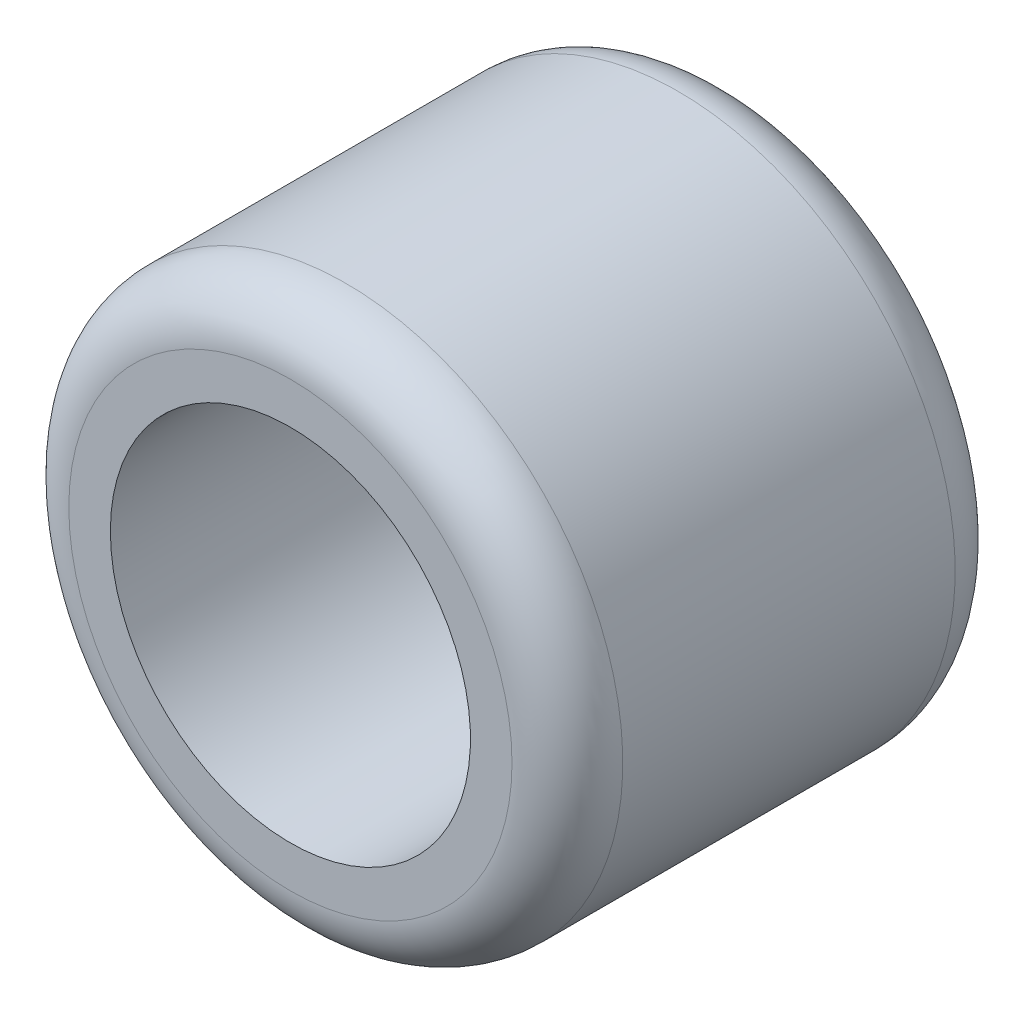
ISO-10303-21;
HEADER;
FILE_DESCRIPTION(('STEP AP214'),'2;1');
FILE_NAME('part.step','',(''),(''),'','','');
FILE_SCHEMA(('AUTOMOTIVE_DESIGN { 1 0 10303 214 1 1 1 1 }'));
ENDSEC;
DATA;
#1=APPLICATION_CONTEXT('core data for automotive mechanical design processes');
#2=APPLICATION_PROTOCOL_DEFINITION('international standard','automotive_design',2000,#1);
#3=PRODUCT_CONTEXT('',#1,'mechanical');
#4=PRODUCT('Part','Part','',(#3));
#5=PRODUCT_RELATED_PRODUCT_CATEGORY('part','',(#4));
#6=PRODUCT_DEFINITION_FORMATION('','',#4);
#7=PRODUCT_DEFINITION_CONTEXT('part definition',#1,'design');
#8=PRODUCT_DEFINITION('design','',#6,#7);
#9=PRODUCT_DEFINITION_SHAPE('','',#8);
#10=(LENGTH_UNIT() NAMED_UNIT(*) SI_UNIT(.MILLI.,.METRE.));
#11=(NAMED_UNIT(*) PLANE_ANGLE_UNIT() SI_UNIT($,.RADIAN.));
#12=(NAMED_UNIT(*) SI_UNIT($,.STERADIAN.) SOLID_ANGLE_UNIT());
#13=UNCERTAINTY_MEASURE_WITH_UNIT(LENGTH_MEASURE(1.E-05),#10,'distance_accuracy_value','');
#14=(GEOMETRIC_REPRESENTATION_CONTEXT(3) GLOBAL_UNCERTAINTY_ASSIGNED_CONTEXT((#13)) GLOBAL_UNIT_ASSIGNED_CONTEXT((#10,
#11,#12)) REPRESENTATION_CONTEXT('',''));
#15=CARTESIAN_POINT('',(0.,0.,0.));
#16=DIRECTION('',(0.,0.,1.));
#17=DIRECTION('',(1.,0.,0.));
#18=AXIS2_PLACEMENT_3D('',#15,#16,#17);
#19=CARTESIAN_POINT('',(0.,0.,-8.));
#20=DIRECTION('',(0.,0.,1.));
#21=DIRECTION('',(1.,0.,0.));
#22=AXIS2_PLACEMENT_3D('',#19,#20,#21);
#23=CYLINDRICAL_SURFACE('',#22,5.);
#24=CARTESIAN_POINT('',(0.,0.,-7.));
#25=DIRECTION('',(0.,0.,-1.));
#26=DIRECTION('',(-1.,0.,0.));
#27=AXIS2_PLACEMENT_3D('',#24,#25,#26);
#28=CIRCLE('',#27,5.);
#29=CARTESIAN_POINT('',(-5.,0.,-7.));
#30=VERTEX_POINT('',#29);
#31=EDGE_CURVE('E21',#30,#30,#28,.F.);
#32=ORIENTED_EDGE('',*,*,#31,.T.);
#33=EDGE_LOOP('',(#32));
#34=FACE_BOUND('',#33,.T.);
#35=CARTESIAN_POINT('',(0.,0.,-1.));
#36=DIRECTION('',(0.,0.,-1.));
#37=DIRECTION('',(-1.,0.,0.));
#38=AXIS2_PLACEMENT_3D('',#35,#36,#37);
#39=CIRCLE('',#38,5.);
#40=CARTESIAN_POINT('',(-5.,0.,-1.));
#41=VERTEX_POINT('',#40);
#42=EDGE_CURVE('E25',#41,#41,#39,.T.);
#43=ORIENTED_EDGE('',*,*,#42,.T.);
#44=EDGE_LOOP('',(#43));
#45=FACE_BOUND('',#44,.T.);
#46=ADVANCED_FACE('F14',(#34,#45),#23,.T.);
#47=CARTESIAN_POINT('',(0.,0.,-8.));
#48=DIRECTION('',(0.,0.,-1.));
#49=DIRECTION('',(-1.,0.,0.));
#50=AXIS2_PLACEMENT_3D('',#47,#48,#49);
#51=PLANE('',#50);
#52=CARTESIAN_POINT('',(0.,0.,-8.));
#53=DIRECTION('',(0.,0.,-1.));
#54=DIRECTION('',(-1.,0.,0.));
#55=AXIS2_PLACEMENT_3D('',#52,#53,#54);
#56=CIRCLE('',#55,3.25);
#57=CARTESIAN_POINT('',(-3.25,0.,-8.));
#58=VERTEX_POINT('',#57);
#59=EDGE_CURVE('E37',#58,#58,#56,.T.);
#60=ORIENTED_EDGE('',*,*,#59,.F.);
#61=EDGE_LOOP('',(#60));
#62=FACE_BOUND('',#61,.T.);
#63=CARTESIAN_POINT('',(0.,0.,-8.));
#64=DIRECTION('',(0.,0.,-1.));
#65=DIRECTION('',(-1.,0.,0.));
#66=AXIS2_PLACEMENT_3D('',#63,#64,#65);
#67=CIRCLE('',#66,4.);
#68=CARTESIAN_POINT('',(-4.,0.,-8.));
#69=VERTEX_POINT('',#68);
#70=EDGE_CURVE('E29',#69,#69,#67,.T.);
#71=ORIENTED_EDGE('',*,*,#70,.T.);
#72=EDGE_LOOP('',(#71));
#73=FACE_BOUND('',#72,.T.);
#74=ADVANCED_FACE('F44',(#62,#73),#51,.T.);
#75=CARTESIAN_POINT('',(0.,0.,0.));
#76=DIRECTION('',(0.,0.,-1.));
#77=DIRECTION('',(-1.,0.,0.));
#78=AXIS2_PLACEMENT_3D('',#75,#76,#77);
#79=PLANE('',#78);
#80=CARTESIAN_POINT('',(0.,0.,0.));
#81=DIRECTION('',(0.,0.,-1.));
#82=DIRECTION('',(-1.,0.,0.));
#83=AXIS2_PLACEMENT_3D('',#80,#81,#82);
#84=CIRCLE('',#83,3.25);
#85=CARTESIAN_POINT('',(-3.25,0.,0.));
#86=VERTEX_POINT('',#85);
#87=EDGE_CURVE('E34',#86,#86,#84,.F.);
#88=ORIENTED_EDGE('',*,*,#87,.F.);
#89=EDGE_LOOP('',(#88));
#90=FACE_BOUND('',#89,.T.);
#91=CARTESIAN_POINT('',(0.,0.,0.));
#92=DIRECTION('',(0.,0.,-1.));
#93=DIRECTION('',(-1.,0.,0.));
#94=AXIS2_PLACEMENT_3D('',#91,#92,#93);
#95=CIRCLE('',#94,4.);
#96=CARTESIAN_POINT('',(-4.,0.,0.));
#97=VERTEX_POINT('',#96);
#98=EDGE_CURVE('E10',#97,#97,#95,.F.);
#99=ORIENTED_EDGE('',*,*,#98,.T.);
#100=EDGE_LOOP('',(#99));
#101=FACE_BOUND('',#100,.T.);
#102=ADVANCED_FACE('F47',(#90,#101),#79,.F.);
#103=CARTESIAN_POINT('',(0.,0.,-7.));
#104=DIRECTION('',(0.,0.,-1.));
#105=DIRECTION('',(-1.,0.,0.));
#106=AXIS2_PLACEMENT_3D('',#103,#104,#105);
#107=TOROIDAL_SURFACE('',#106,4.,1.);
#108=ORIENTED_EDGE('',*,*,#31,.F.);
#109=EDGE_LOOP('',(#108));
#110=FACE_BOUND('',#109,.T.);
#111=ORIENTED_EDGE('',*,*,#70,.F.);
#112=EDGE_LOOP('',(#111));
#113=FACE_BOUND('',#112,.T.);
#114=ADVANCED_FACE('F51',(#110,#113),#107,.T.);
#115=CARTESIAN_POINT('',(0.,0.,-1.));
#116=DIRECTION('',(0.,0.,-1.));
#117=DIRECTION('',(-1.,0.,0.));
#118=AXIS2_PLACEMENT_3D('',#115,#116,#117);
#119=TOROIDAL_SURFACE('',#118,4.,1.);
#120=ORIENTED_EDGE('',*,*,#98,.F.);
#121=EDGE_LOOP('',(#120));
#122=FACE_BOUND('',#121,.T.);
#123=ORIENTED_EDGE('',*,*,#42,.F.);
#124=EDGE_LOOP('',(#123));
#125=FACE_BOUND('',#124,.T.);
#126=ADVANCED_FACE('F16',(#122,#125),#119,.T.);
#127=CARTESIAN_POINT('',(0.,0.,165.001));
#128=DIRECTION('',(0.,0.,-1.));
#129=DIRECTION('',(-1.,0.,0.));
#130=AXIS2_PLACEMENT_3D('',#127,#128,#129);
#131=CYLINDRICAL_SURFACE('',#130,3.25);
#132=ORIENTED_EDGE('',*,*,#59,.T.);
#133=EDGE_LOOP('',(#132));
#134=FACE_BOUND('',#133,.T.);
#135=ORIENTED_EDGE('',*,*,#87,.T.);
#136=EDGE_LOOP('',(#135));
#137=FACE_BOUND('',#136,.T.);
#138=ADVANCED_FACE('F41',(#134,#137),#131,.F.);
#139=CLOSED_SHELL('',(#46,#74,#102,#114,#126,#138));
#140=MANIFOLD_SOLID_BREP('B1',#139);
#141=ADVANCED_BREP_SHAPE_REPRESENTATION('',(#18,#140),#14);
#142=SHAPE_DEFINITION_REPRESENTATION(#9,#141);
ENDSEC;
END-ISO-10303-21;
